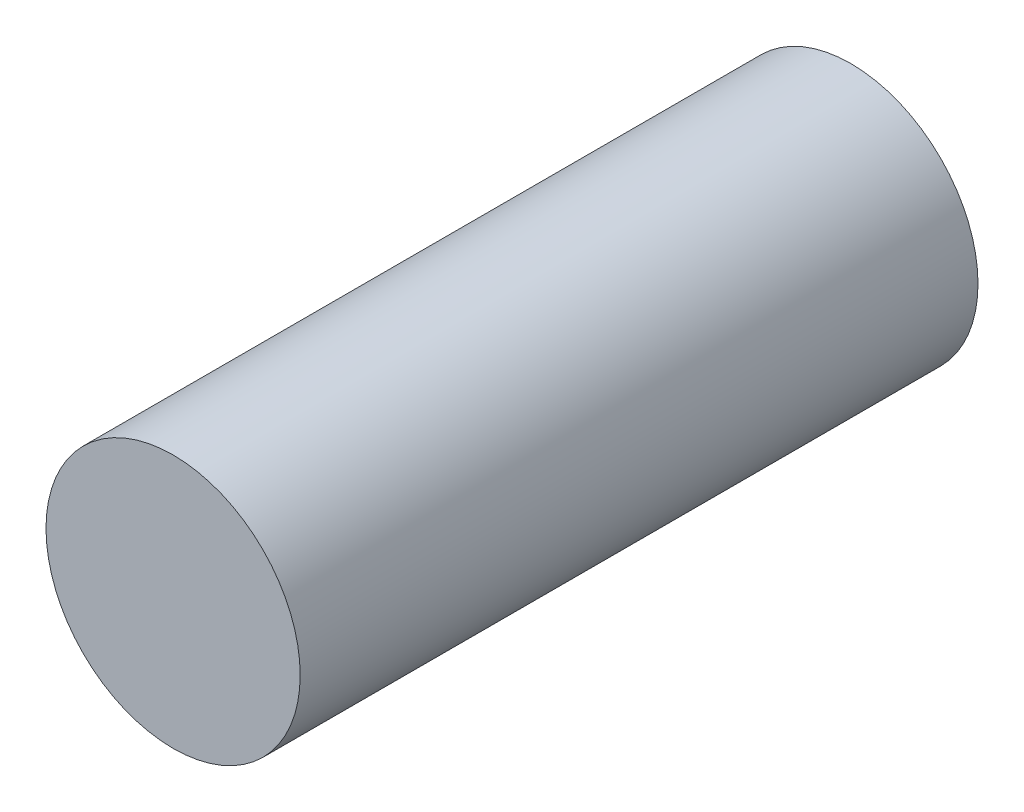
ISO-10303-21;
HEADER;
FILE_DESCRIPTION(('STEP AP214'),'2;1');
FILE_NAME('part.step','',(''),(''),'','','');
FILE_SCHEMA(('AUTOMOTIVE_DESIGN { 1 0 10303 214 1 1 1 1 }'));
ENDSEC;
DATA;
#1=APPLICATION_CONTEXT('core data for automotive mechanical design processes');
#2=APPLICATION_PROTOCOL_DEFINITION('international standard','automotive_design',2000,#1);
#3=PRODUCT_CONTEXT('',#1,'mechanical');
#4=PRODUCT('Part','Part','',(#3));
#5=PRODUCT_RELATED_PRODUCT_CATEGORY('part','',(#4));
#6=PRODUCT_DEFINITION_FORMATION('','',#4);
#7=PRODUCT_DEFINITION_CONTEXT('part definition',#1,'design');
#8=PRODUCT_DEFINITION('design','',#6,#7);
#9=PRODUCT_DEFINITION_SHAPE('','',#8);
#10=(LENGTH_UNIT() NAMED_UNIT(*) SI_UNIT(.MILLI.,.METRE.));
#11=(NAMED_UNIT(*) PLANE_ANGLE_UNIT() SI_UNIT($,.RADIAN.));
#12=(NAMED_UNIT(*) SI_UNIT($,.STERADIAN.) SOLID_ANGLE_UNIT());
#13=UNCERTAINTY_MEASURE_WITH_UNIT(LENGTH_MEASURE(1.E-05),#10,'distance_accuracy_value','');
#14=(GEOMETRIC_REPRESENTATION_CONTEXT(3) GLOBAL_UNCERTAINTY_ASSIGNED_CONTEXT((#13)) GLOBAL_UNIT_ASSIGNED_CONTEXT((#10,
#11,#12)) REPRESENTATION_CONTEXT('',''));
#15=CARTESIAN_POINT('',(0.,0.,0.));
#16=DIRECTION('',(0.,0.,1.));
#17=DIRECTION('',(1.,0.,0.));
#18=AXIS2_PLACEMENT_3D('',#15,#16,#17);
#19=CARTESIAN_POINT('',(0.,0.,40.));
#20=DIRECTION('',(0.,0.,-1.));
#21=DIRECTION('',(-1.,0.,0.));
#22=AXIS2_PLACEMENT_3D('',#19,#20,#21);
#23=CYLINDRICAL_SURFACE('',#22,7.5);
#24=CARTESIAN_POINT('',(0.,0.,40.));
#25=DIRECTION('',(0.,0.,1.));
#26=DIRECTION('',(1.,0.,0.));
#27=AXIS2_PLACEMENT_3D('',#24,#25,#26);
#28=CIRCLE('',#27,7.5);
#29=CARTESIAN_POINT('',(7.5,0.,40.));
#30=VERTEX_POINT('',#29);
#31=EDGE_CURVE('E10',#30,#30,#28,.T.);
#32=ORIENTED_EDGE('',*,*,#31,.F.);
#33=EDGE_LOOP('',(#32));
#34=FACE_BOUND('',#33,.T.);
#35=CARTESIAN_POINT('',(0.,0.,0.));
#36=DIRECTION('',(0.,0.,1.));
#37=DIRECTION('',(1.,0.,0.));
#38=AXIS2_PLACEMENT_3D('',#35,#36,#37);
#39=CIRCLE('',#38,7.5);
#40=CARTESIAN_POINT('',(7.5,0.,0.));
#41=VERTEX_POINT('',#40);
#42=EDGE_CURVE('E40',#41,#41,#39,.T.);
#43=ORIENTED_EDGE('',*,*,#42,.T.);
#44=EDGE_LOOP('',(#43));
#45=FACE_BOUND('',#44,.T.);
#46=ADVANCED_FACE('F37',(#34,#45),#23,.T.);
#47=CARTESIAN_POINT('',(0.,0.,40.));
#48=DIRECTION('',(0.,0.,1.));
#49=DIRECTION('',(1.,0.,0.));
#50=AXIS2_PLACEMENT_3D('',#47,#48,#49);
#51=PLANE('',#50);
#52=ORIENTED_EDGE('',*,*,#31,.T.);
#53=EDGE_LOOP('',(#52));
#54=FACE_BOUND('',#53,.T.);
#55=ADVANCED_FACE('F54',(#54),#51,.T.);
#56=CARTESIAN_POINT('',(0.,0.,0.));
#57=DIRECTION('',(0.,0.,1.));
#58=DIRECTION('',(1.,0.,0.));
#59=AXIS2_PLACEMENT_3D('',#56,#57,#58);
#60=PLANE('',#59);
#61=ORIENTED_EDGE('',*,*,#42,.F.);
#62=EDGE_LOOP('',(#61));
#63=FACE_BOUND('',#62,.T.);
#64=ADVANCED_FACE('F52',(#63),#60,.F.);
#65=CLOSED_SHELL('',(#46,#55,#64));
#66=MANIFOLD_SOLID_BREP('B2',#65);
#67=ADVANCED_BREP_SHAPE_REPRESENTATION('',(#18,#66),#14);
#68=SHAPE_DEFINITION_REPRESENTATION(#9,#67);
ENDSEC;
END-ISO-10303-21;
